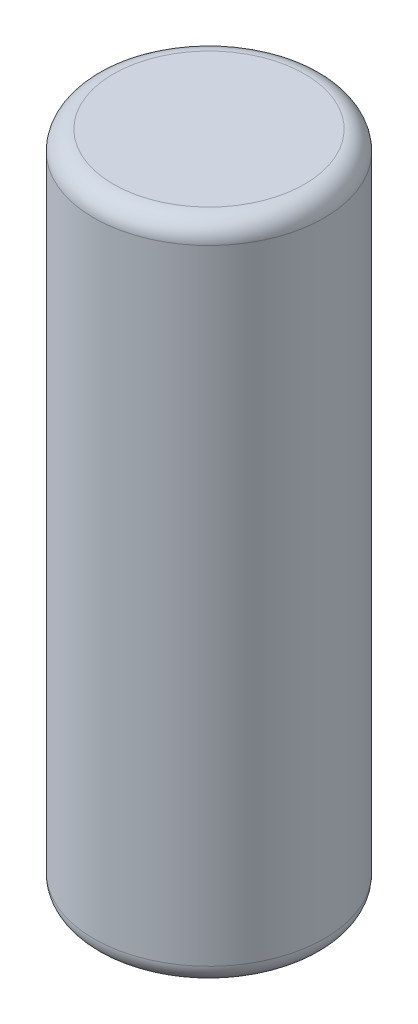
ISO-10303-21;
HEADER;
FILE_DESCRIPTION(('STEP AP214'),'2;1');
FILE_NAME('part.step','',(''),(''),'','','');
FILE_SCHEMA(('AUTOMOTIVE_DESIGN { 1 0 10303 214 1 1 1 1 }'));
ENDSEC;
DATA;
#1=APPLICATION_CONTEXT('core data for automotive mechanical design processes');
#2=APPLICATION_PROTOCOL_DEFINITION('international standard','automotive_design',2000,#1);
#3=PRODUCT_CONTEXT('',#1,'mechanical');
#4=PRODUCT('Part','Part','',(#3));
#5=PRODUCT_RELATED_PRODUCT_CATEGORY('part','',(#4));
#6=PRODUCT_DEFINITION_FORMATION('','',#4);
#7=PRODUCT_DEFINITION_CONTEXT('part definition',#1,'design');
#8=PRODUCT_DEFINITION('design','',#6,#7);
#9=PRODUCT_DEFINITION_SHAPE('','',#8);
#10=(LENGTH_UNIT() NAMED_UNIT(*) SI_UNIT(.MILLI.,.METRE.));
#11=(NAMED_UNIT(*) PLANE_ANGLE_UNIT() SI_UNIT($,.RADIAN.));
#12=(NAMED_UNIT(*) SI_UNIT($,.STERADIAN.) SOLID_ANGLE_UNIT());
#13=UNCERTAINTY_MEASURE_WITH_UNIT(LENGTH_MEASURE(1.E-05),#10,'distance_accuracy_value','');
#14=(GEOMETRIC_REPRESENTATION_CONTEXT(3) GLOBAL_UNCERTAINTY_ASSIGNED_CONTEXT((#13)) GLOBAL_UNIT_ASSIGNED_CONTEXT((#10,
#11,#12)) REPRESENTATION_CONTEXT('',''));
#15=CARTESIAN_POINT('',(0.,0.,0.));
#16=DIRECTION('',(0.,0.,1.));
#17=DIRECTION('',(1.,0.,0.));
#18=AXIS2_PLACEMENT_3D('',#15,#16,#17);
#19=CARTESIAN_POINT('',(0.,17.,0.));
#20=DIRECTION('',(0.,-1.,0.));
#21=DIRECTION('',(0.,0.,-1.));
#22=AXIS2_PLACEMENT_3D('',#19,#20,#21);
#23=CYLINDRICAL_SURFACE('',#22,2.95);
#24=CARTESIAN_POINT('',(0.,0.5,0.));
#25=DIRECTION('',(0.,1.,0.));
#26=DIRECTION('',(0.,0.,1.));
#27=AXIS2_PLACEMENT_3D('',#24,#25,#26);
#28=CIRCLE('',#27,2.95);
#29=CARTESIAN_POINT('',(0.,0.5,2.95));
#30=VERTEX_POINT('',#29);
#31=EDGE_CURVE('E50',#30,#30,#28,.T.);
#32=ORIENTED_EDGE('',*,*,#31,.T.);
#33=EDGE_LOOP('',(#32));
#34=FACE_BOUND('',#33,.T.);
#35=CARTESIAN_POINT('',(0.,16.5,0.));
#36=DIRECTION('',(0.,1.,0.));
#37=DIRECTION('',(0.,0.,1.));
#38=AXIS2_PLACEMENT_3D('',#35,#36,#37);
#39=CIRCLE('',#38,2.95);
#40=CARTESIAN_POINT('',(0.,16.5,2.95));
#41=VERTEX_POINT('',#40);
#42=EDGE_CURVE('E55',#41,#41,#39,.F.);
#43=ORIENTED_EDGE('',*,*,#42,.T.);
#44=EDGE_LOOP('',(#43));
#45=FACE_BOUND('',#44,.T.);
#46=ADVANCED_FACE('F37',(#34,#45),#23,.T.);
#47=CARTESIAN_POINT('',(0.,17.,0.));
#48=DIRECTION('',(0.,1.,0.));
#49=DIRECTION('',(0.,0.,1.));
#50=AXIS2_PLACEMENT_3D('',#47,#48,#49);
#51=PLANE('',#50);
#52=CARTESIAN_POINT('',(0.,17.,0.));
#53=DIRECTION('',(0.,1.,0.));
#54=DIRECTION('',(0.,0.,1.));
#55=AXIS2_PLACEMENT_3D('',#52,#53,#54);
#56=CIRCLE('',#55,2.45);
#57=CARTESIAN_POINT('',(0.,17.,2.45));
#58=VERTEX_POINT('',#57);
#59=EDGE_CURVE('E10',#58,#58,#56,.T.);
#60=ORIENTED_EDGE('',*,*,#59,.T.);
#61=EDGE_LOOP('',(#60));
#62=FACE_BOUND('',#61,.T.);
#63=ADVANCED_FACE('F72',(#62),#51,.T.);
#64=CARTESIAN_POINT('',(0.,0.,0.));
#65=DIRECTION('',(0.,1.,0.));
#66=DIRECTION('',(0.,0.,1.));
#67=AXIS2_PLACEMENT_3D('',#64,#65,#66);
#68=PLANE('',#67);
#69=CARTESIAN_POINT('',(0.,0.,0.));
#70=DIRECTION('',(0.,1.,0.));
#71=DIRECTION('',(0.,0.,1.));
#72=AXIS2_PLACEMENT_3D('',#69,#70,#71);
#73=CIRCLE('',#72,2.45);
#74=CARTESIAN_POINT('',(0.,0.,2.45));
#75=VERTEX_POINT('',#74);
#76=EDGE_CURVE('E45',#75,#75,#73,.F.);
#77=ORIENTED_EDGE('',*,*,#76,.T.);
#78=EDGE_LOOP('',(#77));
#79=FACE_BOUND('',#78,.T.);
#80=ADVANCED_FACE('F69',(#79),#68,.F.);
#81=CARTESIAN_POINT('',(0.,0.5,0.));
#82=DIRECTION('',(0.,1.,0.));
#83=DIRECTION('',(0.,0.,1.));
#84=AXIS2_PLACEMENT_3D('',#81,#82,#83);
#85=TOROIDAL_SURFACE('',#84,2.45,0.5);
#86=ORIENTED_EDGE('',*,*,#76,.F.);
#87=EDGE_LOOP('',(#86));
#88=FACE_BOUND('',#87,.T.);
#89=ORIENTED_EDGE('',*,*,#31,.F.);
#90=EDGE_LOOP('',(#89));
#91=FACE_BOUND('',#90,.T.);
#92=ADVANCED_FACE('F65',(#88,#91),#85,.T.);
#93=CARTESIAN_POINT('',(0.,16.5,0.));
#94=DIRECTION('',(0.,1.,0.));
#95=DIRECTION('',(0.,0.,1.));
#96=AXIS2_PLACEMENT_3D('',#93,#94,#95);
#97=TOROIDAL_SURFACE('',#96,2.45,0.5);
#98=ORIENTED_EDGE('',*,*,#42,.F.);
#99=EDGE_LOOP('',(#98));
#100=FACE_BOUND('',#99,.T.);
#101=ORIENTED_EDGE('',*,*,#59,.F.);
#102=EDGE_LOOP('',(#101));
#103=FACE_BOUND('',#102,.T.);
#104=ADVANCED_FACE('F39',(#100,#103),#97,.T.);
#105=CLOSED_SHELL('',(#46,#63,#80,#92,#104));
#106=MANIFOLD_SOLID_BREP('B2',#105);
#107=ADVANCED_BREP_SHAPE_REPRESENTATION('',(#18,#106),#14);
#108=SHAPE_DEFINITION_REPRESENTATION(#9,#107);
ENDSEC;
END-ISO-10303-21;
